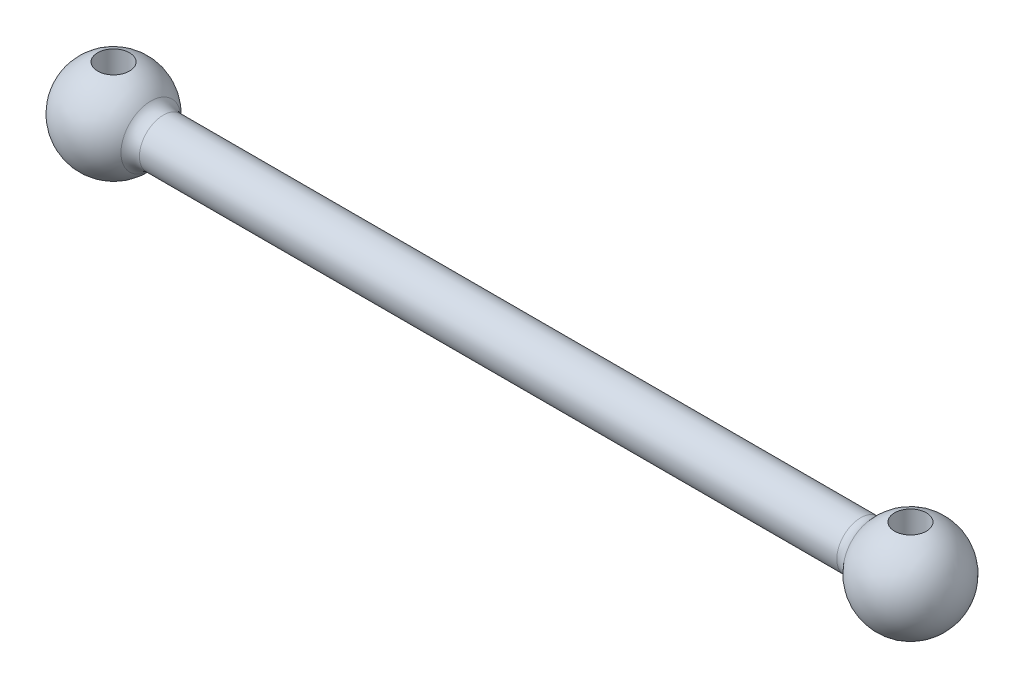
ISO-10303-21;
HEADER;
FILE_DESCRIPTION(('STEP AP214'),'2;1');
FILE_NAME('part.step','',(''),(''),'','','');
FILE_SCHEMA(('AUTOMOTIVE_DESIGN { 1 0 10303 214 1 1 1 1 }'));
ENDSEC;
DATA;
#1=APPLICATION_CONTEXT('core data for automotive mechanical design processes');
#2=APPLICATION_PROTOCOL_DEFINITION('international standard','automotive_design',2000,#1);
#3=PRODUCT_CONTEXT('',#1,'mechanical');
#4=PRODUCT('Part','Part','',(#3));
#5=PRODUCT_RELATED_PRODUCT_CATEGORY('part','',(#4));
#6=PRODUCT_DEFINITION_FORMATION('','',#4);
#7=PRODUCT_DEFINITION_CONTEXT('part definition',#1,'design');
#8=PRODUCT_DEFINITION('design','',#6,#7);
#9=PRODUCT_DEFINITION_SHAPE('','',#8);
#10=(LENGTH_UNIT() NAMED_UNIT(*) SI_UNIT(.MILLI.,.METRE.));
#11=(NAMED_UNIT(*) PLANE_ANGLE_UNIT() SI_UNIT($,.RADIAN.));
#12=(NAMED_UNIT(*) SI_UNIT($,.STERADIAN.) SOLID_ANGLE_UNIT());
#13=UNCERTAINTY_MEASURE_WITH_UNIT(LENGTH_MEASURE(1.E-05),#10,'distance_accuracy_value','');
#14=(GEOMETRIC_REPRESENTATION_CONTEXT(3) GLOBAL_UNCERTAINTY_ASSIGNED_CONTEXT((#13)) GLOBAL_UNIT_ASSIGNED_CONTEXT((#10,
#11,#12)) REPRESENTATION_CONTEXT('',''));
#15=CARTESIAN_POINT('',(0.,0.,0.));
#16=DIRECTION('',(0.,0.,1.));
#17=DIRECTION('',(1.,0.,0.));
#18=AXIS2_PLACEMENT_3D('',#15,#16,#17);
#19=CARTESIAN_POINT('',(-25.,0.,0.));
#20=DIRECTION('',(1.,0.,0.));
#21=DIRECTION('',(0.,1.,0.));
#22=AXIS2_PLACEMENT_3D('',#19,#20,#21);
#23=SPHERICAL_SURFACE('',#22,3.);
#24=CARTESIAN_POINT('',(-22.6581257506006,0.,0.));
#25=DIRECTION('',(-1.,0.,0.));
#26=DIRECTION('',(0.,0.,1.));
#27=AXIS2_PLACEMENT_3D('',#24,#25,#26);
#28=CIRCLE('',#27,1.875);
#29=CARTESIAN_POINT('',(-22.6581257506006,0.,1.875));
#30=VERTEX_POINT('',#29);
#31=EDGE_CURVE('E45',#30,#30,#28,.T.);
#32=ORIENTED_EDGE('',*,*,#31,.T.);
#33=EDGE_LOOP('',(#32));
#34=FACE_BOUND('',#33,.T.);
#35=CARTESIAN_POINT('',(-25.,-2.82842712474619,0.));
#36=DIRECTION('',(0.,1.,0.));
#37=DIRECTION('',(0.,0.,1.));
#38=AXIS2_PLACEMENT_3D('',#35,#36,#37);
#39=CIRCLE('',#38,1.);
#40=CARTESIAN_POINT('',(-25.,-2.82842712474619,1.));
#41=VERTEX_POINT('',#40);
#42=EDGE_CURVE('E63',#41,#41,#39,.F.);
#43=ORIENTED_EDGE('',*,*,#42,.F.);
#44=EDGE_LOOP('',(#43));
#45=FACE_BOUND('',#44,.T.);
#46=CARTESIAN_POINT('',(-25.,2.82842712474619,0.));
#47=DIRECTION('',(0.,-1.,0.));
#48=DIRECTION('',(0.,0.,-1.));
#49=AXIS2_PLACEMENT_3D('',#46,#47,#48);
#50=CIRCLE('',#49,1.);
#51=CARTESIAN_POINT('',(-25.,2.82842712474619,-1.));
#52=VERTEX_POINT('',#51);
#53=EDGE_CURVE('E59',#52,#52,#50,.F.);
#54=ORIENTED_EDGE('',*,*,#53,.F.);
#55=EDGE_LOOP('',(#54));
#56=FACE_BOUND('',#55,.T.);
#57=ADVANCED_FACE('F38',(#34,#45,#56),#23,.T.);
#58=CARTESIAN_POINT('',(0.,0.,0.));
#59=DIRECTION('',(-1.,0.,0.));
#60=DIRECTION('',(0.,0.,1.));
#61=AXIS2_PLACEMENT_3D('',#58,#59,#60);
#62=CYLINDRICAL_SURFACE('',#61,1.5);
#63=CARTESIAN_POINT('',(-21.8775010008008,0.,0.));
#64=DIRECTION('',(-1.,0.,0.));
#65=DIRECTION('',(0.,0.,1.));
#66=AXIS2_PLACEMENT_3D('',#63,#64,#65);
#67=CIRCLE('',#66,1.5);
#68=CARTESIAN_POINT('',(-21.8775010008008,0.,1.5));
#69=VERTEX_POINT('',#68);
#70=EDGE_CURVE('E10',#69,#69,#67,.F.);
#71=CARTESIAN_POINT('',(21.8775010008008,0.,0.));
#72=DIRECTION('',(1.,0.,0.));
#73=DIRECTION('',(0.,0.,-1.));
#74=AXIS2_PLACEMENT_3D('',#71,#72,#73);
#75=CIRCLE('',#74,1.5);
#76=CARTESIAN_POINT('',(21.8775010008008,0.,1.5));
#77=VERTEX_POINT('',#76);
#78=EDGE_CURVE('E53',#77,#77,#75,.F.);
#79=CARTESIAN_POINT('',(-21.8775010008008,0.,1.5));
#80=CARTESIAN_POINT('',(-21.4217197299508,0.,1.5));
#81=CARTESIAN_POINT('',(-20.9659384591008,0.,1.5));
#82=CARTESIAN_POINT('',(-20.0543759174007,0.,1.5));
#83=CARTESIAN_POINT('',(-19.5985946465507,0.,1.5));
#84=CARTESIAN_POINT('',(-18.6870321048507,0.,1.5));
#85=CARTESIAN_POINT('',(-18.2312508340007,0.,1.5));
#86=CARTESIAN_POINT('',(-17.3196882923006,0.,1.5));
#87=CARTESIAN_POINT('',(-16.8639070214506,0.,1.5));
#88=CARTESIAN_POINT('',(-15.9523444797506,0.,1.5));
#89=CARTESIAN_POINT('',(-15.4965632089006,0.,1.5));
#90=CARTESIAN_POINT('',(-14.5850006672005,0.,1.5));
#91=CARTESIAN_POINT('',(-14.1292193963505,0.,1.5));
#92=CARTESIAN_POINT('',(-13.2176568546505,0.,1.5));
#93=CARTESIAN_POINT('',(-12.7618755838005,0.,1.5));
#94=CARTESIAN_POINT('',(-11.8503130421004,0.,1.5));
#95=CARTESIAN_POINT('',(-11.3945317712504,0.,1.5));
#96=CARTESIAN_POINT('',(-10.4829692295504,0.,1.5));
#97=CARTESIAN_POINT('',(-10.0271879587004,0.,1.5));
#98=CARTESIAN_POINT('',(-9.11562541700034,0.,1.5));
#99=CARTESIAN_POINT('',(-8.65984414615032,0.,1.5));
#100=CARTESIAN_POINT('',(-7.74828160445028,0.,1.5));
#101=CARTESIAN_POINT('',(-7.29250033360027,0.,1.5));
#102=CARTESIAN_POINT('',(-6.38093779190023,0.,1.5));
#103=CARTESIAN_POINT('',(-5.92515652105022,0.,1.5));
#104=CARTESIAN_POINT('',(-5.01359397935018,0.,1.5));
#105=CARTESIAN_POINT('',(-4.55781270850017,0.,1.5));
#106=CARTESIAN_POINT('',(-3.64625016680013,0.,1.5));
#107=CARTESIAN_POINT('',(-3.19046889595012,0.,1.5));
#108=CARTESIAN_POINT('',(-2.27890635425008,0.,1.5));
#109=CARTESIAN_POINT('',(-1.82312508340007,0.,1.5));
#110=CARTESIAN_POINT('',(-0.911562541700034,0.,1.5));
#111=CARTESIAN_POINT('',(-0.455781270850017,0.,1.5));
#112=CARTESIAN_POINT('',(0.455781270850017,0.,1.5));
#113=CARTESIAN_POINT('',(0.911562541700034,0.,1.5));
#114=CARTESIAN_POINT('',(1.82312508340007,0.,1.5));
#115=CARTESIAN_POINT('',(2.27890635425008,0.,1.5));
#116=CARTESIAN_POINT('',(3.19046889595012,0.,1.5));
#117=CARTESIAN_POINT('',(3.64625016680013,0.,1.5));
#118=CARTESIAN_POINT('',(4.55781270850017,0.,1.5));
#119=CARTESIAN_POINT('',(5.01359397935018,0.,1.5));
#120=CARTESIAN_POINT('',(5.92515652105022,0.,1.5));
#121=CARTESIAN_POINT('',(6.38093779190023,0.,1.5));
#122=CARTESIAN_POINT('',(7.29250033360027,0.,1.5));
#123=CARTESIAN_POINT('',(7.74828160445028,0.,1.5));
#124=CARTESIAN_POINT('',(8.65984414615032,0.,1.5));
#125=CARTESIAN_POINT('',(9.11562541700033,0.,1.5));
#126=CARTESIAN_POINT('',(10.0271879587004,0.,1.5));
#127=CARTESIAN_POINT('',(10.4829692295504,0.,1.5));
#128=CARTESIAN_POINT('',(11.3945317712504,0.,1.5));
#129=CARTESIAN_POINT('',(11.8503130421004,0.,1.5));
#130=CARTESIAN_POINT('',(12.7618755838005,0.,1.5));
#131=CARTESIAN_POINT('',(13.2176568546505,0.,1.5));
#132=CARTESIAN_POINT('',(14.1292193963505,0.,1.5));
#133=CARTESIAN_POINT('',(14.5850006672005,0.,1.5));
#134=CARTESIAN_POINT('',(15.4965632089006,0.,1.5));
#135=CARTESIAN_POINT('',(15.9523444797506,0.,1.5));
#136=CARTESIAN_POINT('',(16.8639070214506,0.,1.5));
#137=CARTESIAN_POINT('',(17.3196882923006,0.,1.5));
#138=CARTESIAN_POINT('',(18.2312508340007,0.,1.5));
#139=CARTESIAN_POINT('',(18.6870321048507,0.,1.5));
#140=CARTESIAN_POINT('',(19.5985946465507,0.,1.5));
#141=CARTESIAN_POINT('',(20.0543759174007,0.,1.5));
#142=CARTESIAN_POINT('',(20.9659384591008,0.,1.5));
#143=CARTESIAN_POINT('',(21.4217197299508,0.,1.5));
#144=CARTESIAN_POINT('',(21.8775010008008,0.,1.5));
#145=B_SPLINE_CURVE_WITH_KNOTS('',3,(#79,#80,#81,#82,#83,#84,#85,#86,#87,#88,#89,#90,#91,#92,
#93,#94,#95,#96,#97,#98,#99,#100,#101,#102,#103,#104,#105,#106,#107,#108,#109,#110,#111,#112,
#113,#114,#115,#116,#117,#118,#119,#120,#121,#122,#123,#124,#125,#126,#127,#128,#129,#130,#131,
#132,#133,#134,#135,#136,#137,#138,#139,#140,#141,#142,#143,#144),.UNSPECIFIED.,.F.,.F.,(4,2,2,
2,2,2,2,2,2,2,2,2,2,2,2,2,2,2,2,2,2,2,2,2,2,2,2,2,2,2,2,2,4),(0.,1.36734381255005,
2.7346876251001,4.10203143765015,5.4693752502002,6.83671906275025,8.2040628753003,
9.57140668785035,10.9387505004004,12.3060943129505,13.6734381255005,15.0407819380506,
16.4081257506006,17.7754695631507,19.1428133757007,20.5101571882508,21.8775010008008,
23.2448448133509,24.6121886259009,25.979532438451,27.346876251001,28.7142200635511,
30.0815638761011,31.4489076886512,32.8162515012012,34.1835953137513,35.5509391263013,
36.9182829388514,38.2856267514014,39.6529705639515,41.0203143765015,42.3876581890516,
43.7550020016016),.UNSPECIFIED.);
#146=EDGE_CURVE('BSEAM81',#69,#77,#145,.T.);
#147=ORIENTED_EDGE('',*,*,#70,.T.);
#148=ORIENTED_EDGE('',*,*,#78,.T.);
#149=ORIENTED_EDGE('',*,*,#146,.T.);
#150=ORIENTED_EDGE('',*,*,#146,.F.);
#151=EDGE_LOOP('',(#147,#149,#148,#150));
#152=FACE_BOUND('',#151,.T.);
#153=ADVANCED_FACE('F81',(#152),#62,.T.);
#154=CARTESIAN_POINT('',(25.,0.,0.));
#155=DIRECTION('',(-1.,0.,0.));
#156=DIRECTION('',(0.,1.,0.));
#157=AXIS2_PLACEMENT_3D('',#154,#155,#156);
#158=SPHERICAL_SURFACE('',#157,3.);
#159=CARTESIAN_POINT('',(22.6581257506006,0.,0.));
#160=DIRECTION('',(1.,0.,0.));
#161=DIRECTION('',(0.,0.,-1.));
#162=AXIS2_PLACEMENT_3D('',#159,#160,#161);
#163=CIRCLE('',#162,1.875);
#164=CARTESIAN_POINT('',(22.6581257506006,0.,-1.875));
#165=VERTEX_POINT('',#164);
#166=EDGE_CURVE('E49',#165,#165,#163,.T.);
#167=ORIENTED_EDGE('',*,*,#166,.T.);
#168=EDGE_LOOP('',(#167));
#169=FACE_BOUND('',#168,.T.);
#170=CARTESIAN_POINT('',(25.,2.82842712474619,0.));
#171=DIRECTION('',(0.,-1.,0.));
#172=DIRECTION('',(0.,0.,-1.));
#173=AXIS2_PLACEMENT_3D('',#170,#171,#172);
#174=CIRCLE('',#173,1.);
#175=CARTESIAN_POINT('',(25.,2.82842712474619,-1.));
#176=VERTEX_POINT('',#175);
#177=EDGE_CURVE('E58',#176,#176,#174,.T.);
#178=ORIENTED_EDGE('',*,*,#177,.T.);
#179=EDGE_LOOP('',(#178));
#180=FACE_BOUND('',#179,.T.);
#181=CARTESIAN_POINT('',(25.,-2.82842712474619,0.));
#182=DIRECTION('',(0.,1.,0.));
#183=DIRECTION('',(0.,0.,1.));
#184=AXIS2_PLACEMENT_3D('',#181,#182,#183);
#185=CIRCLE('',#184,1.);
#186=CARTESIAN_POINT('',(25.,-2.82842712474619,1.));
#187=VERTEX_POINT('',#186);
#188=EDGE_CURVE('E62',#187,#187,#185,.T.);
#189=ORIENTED_EDGE('',*,*,#188,.T.);
#190=EDGE_LOOP('',(#189));
#191=FACE_BOUND('',#190,.T.);
#192=ADVANCED_FACE('F71',(#169,#180,#191),#158,.T.);
#193=CARTESIAN_POINT('',(25.,-3.,0.));
#194=DIRECTION('',(0.,1.,0.));
#195=DIRECTION('',(0.,0.,1.));
#196=AXIS2_PLACEMENT_3D('',#193,#194,#195);
#197=CYLINDRICAL_SURFACE('',#196,1.);
#198=ORIENTED_EDGE('',*,*,#188,.F.);
#199=EDGE_LOOP('',(#198));
#200=FACE_BOUND('',#199,.T.);
#201=ORIENTED_EDGE('',*,*,#177,.F.);
#202=EDGE_LOOP('',(#201));
#203=FACE_BOUND('',#202,.T.);
#204=ADVANCED_FACE('F73',(#200,#203),#197,.F.);
#205=CARTESIAN_POINT('',(-25.,-3.,0.));
#206=DIRECTION('',(0.,1.,0.));
#207=DIRECTION('',(0.,0.,1.));
#208=AXIS2_PLACEMENT_3D('',#205,#206,#207);
#209=CYLINDRICAL_SURFACE('',#208,1.);
#210=ORIENTED_EDGE('',*,*,#42,.T.);
#211=EDGE_LOOP('',(#210));
#212=FACE_BOUND('',#211,.T.);
#213=ORIENTED_EDGE('',*,*,#53,.T.);
#214=EDGE_LOOP('',(#213));
#215=FACE_BOUND('',#214,.T.);
#216=ADVANCED_FACE('F76',(#212,#215),#209,.F.);
#217=CARTESIAN_POINT('',(21.8775010008008,0.,0.));
#218=DIRECTION('',(1.,0.,0.));
#219=DIRECTION('',(0.,0.,-1.));
#220=AXIS2_PLACEMENT_3D('',#217,#218,#219);
#221=TOROIDAL_SURFACE('',#220,2.5,1.);
#222=ORIENTED_EDGE('',*,*,#166,.F.);
#223=EDGE_LOOP('',(#222));
#224=FACE_BOUND('',#223,.T.);
#225=ORIENTED_EDGE('',*,*,#78,.F.);
#226=EDGE_LOOP('',(#225));
#227=FACE_BOUND('',#226,.T.);
#228=ADVANCED_FACE('F95',(#224,#227),#221,.F.);
#229=CARTESIAN_POINT('',(-21.8775010008008,0.,0.));
#230=DIRECTION('',(-1.,0.,0.));
#231=DIRECTION('',(0.,0.,1.));
#232=AXIS2_PLACEMENT_3D('',#229,#230,#231);
#233=TOROIDAL_SURFACE('',#232,2.5,1.);
#234=ORIENTED_EDGE('',*,*,#70,.F.);
#235=EDGE_LOOP('',(#234));
#236=FACE_BOUND('',#235,.T.);
#237=ORIENTED_EDGE('',*,*,#31,.F.);
#238=EDGE_LOOP('',(#237));
#239=FACE_BOUND('',#238,.T.);
#240=ADVANCED_FACE('F40',(#236,#239),#233,.F.);
#241=CLOSED_SHELL('',(#57,#153,#192,#204,#216,#228,#240));
#242=MANIFOLD_SOLID_BREP('B2',#241);
#243=ADVANCED_BREP_SHAPE_REPRESENTATION('',(#18,#242),#14);
#244=SHAPE_DEFINITION_REPRESENTATION(#9,#243);
ENDSEC;
END-ISO-10303-21;
